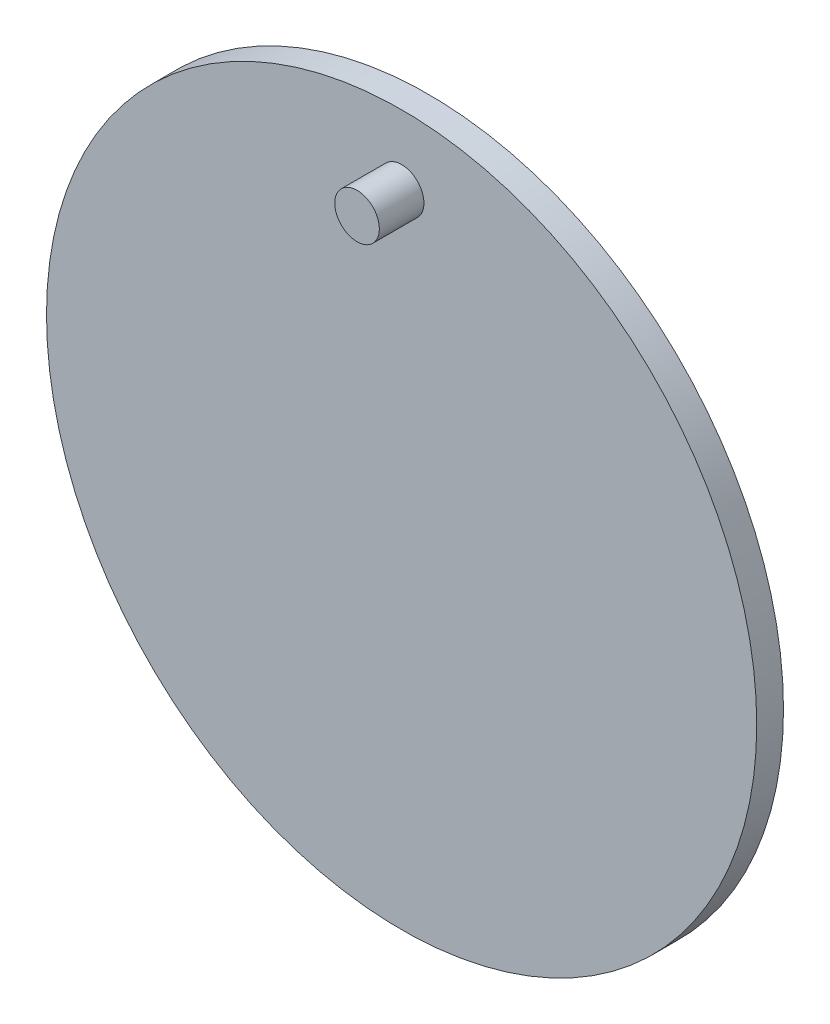
ISO-10303-21;
HEADER;
FILE_DESCRIPTION(('STEP AP214'),'2;1');
FILE_NAME('part.step','',(''),(''),'','','');
FILE_SCHEMA(('AUTOMOTIVE_DESIGN { 1 0 10303 214 1 1 1 1 }'));
ENDSEC;
DATA;
#1=APPLICATION_CONTEXT('core data for automotive mechanical design processes');
#2=APPLICATION_PROTOCOL_DEFINITION('international standard','automotive_design',2000,#1);
#3=PRODUCT_CONTEXT('',#1,'mechanical');
#4=PRODUCT('Part','Part','',(#3));
#5=PRODUCT_RELATED_PRODUCT_CATEGORY('part','',(#4));
#6=PRODUCT_DEFINITION_FORMATION('','',#4);
#7=PRODUCT_DEFINITION_CONTEXT('part definition',#1,'design');
#8=PRODUCT_DEFINITION('design','',#6,#7);
#9=PRODUCT_DEFINITION_SHAPE('','',#8);
#10=(LENGTH_UNIT() NAMED_UNIT(*) SI_UNIT(.MILLI.,.METRE.));
#11=(NAMED_UNIT(*) PLANE_ANGLE_UNIT() SI_UNIT($,.RADIAN.));
#12=(NAMED_UNIT(*) SI_UNIT($,.STERADIAN.) SOLID_ANGLE_UNIT());
#13=UNCERTAINTY_MEASURE_WITH_UNIT(LENGTH_MEASURE(1.E-05),#10,'distance_accuracy_value','');
#14=(GEOMETRIC_REPRESENTATION_CONTEXT(3) GLOBAL_UNCERTAINTY_ASSIGNED_CONTEXT((#13)) GLOBAL_UNIT_ASSIGNED_CONTEXT((#10,
#11,#12)) REPRESENTATION_CONTEXT('',''));
#15=CARTESIAN_POINT('',(0.,0.,0.));
#16=DIRECTION('',(0.,0.,1.));
#17=DIRECTION('',(1.,0.,0.));
#18=AXIS2_PLACEMENT_3D('',#15,#16,#17);
#19=CARTESIAN_POINT('',(0.,0.,3.));
#20=DIRECTION('',(0.,0.,-1.));
#21=DIRECTION('',(-1.,0.,0.));
#22=AXIS2_PLACEMENT_3D('',#19,#20,#21);
#23=CYLINDRICAL_SURFACE('',#22,39.83);
#24=CARTESIAN_POINT('',(0.,0.,3.));
#25=DIRECTION('',(0.,0.,1.));
#26=DIRECTION('',(1.,0.,0.));
#27=AXIS2_PLACEMENT_3D('',#24,#25,#26);
#28=CIRCLE('',#27,39.83);
#29=CARTESIAN_POINT('',(39.83,0.,3.));
#30=VERTEX_POINT('',#29);
#31=EDGE_CURVE('E10',#30,#30,#28,.T.);
#32=ORIENTED_EDGE('',*,*,#31,.F.);
#33=EDGE_LOOP('',(#32));
#34=FACE_BOUND('',#33,.T.);
#35=CARTESIAN_POINT('',(0.,0.,0.));
#36=DIRECTION('',(0.,0.,1.));
#37=DIRECTION('',(1.,0.,0.));
#38=AXIS2_PLACEMENT_3D('',#35,#36,#37);
#39=CIRCLE('',#38,39.83);
#40=CARTESIAN_POINT('',(39.83,0.,0.));
#41=VERTEX_POINT('',#40);
#42=EDGE_CURVE('E33',#41,#41,#39,.T.);
#43=ORIENTED_EDGE('',*,*,#42,.T.);
#44=EDGE_LOOP('',(#43));
#45=FACE_BOUND('',#44,.T.);
#46=ADVANCED_FACE('F30',(#34,#45),#23,.T.);
#47=CARTESIAN_POINT('',(0.,0.,3.));
#48=DIRECTION('',(0.,0.,1.));
#49=DIRECTION('',(1.,0.,0.));
#50=AXIS2_PLACEMENT_3D('',#47,#48,#49);
#51=PLANE('',#50);
#52=CARTESIAN_POINT('',(0.,32.,3.));
#53=DIRECTION('',(0.,0.,1.));
#54=DIRECTION('',(1.,0.,0.));
#55=AXIS2_PLACEMENT_3D('',#52,#53,#54);
#56=CIRCLE('',#55,2.5);
#57=CARTESIAN_POINT('',(2.5,32.,3.));
#58=VERTEX_POINT('',#57);
#59=EDGE_CURVE('E42',#58,#58,#56,.T.);
#60=ORIENTED_EDGE('',*,*,#59,.F.);
#61=EDGE_LOOP('',(#60));
#62=FACE_BOUND('',#61,.T.);
#63=ORIENTED_EDGE('',*,*,#31,.T.);
#64=EDGE_LOOP('',(#63));
#65=FACE_BOUND('',#64,.T.);
#66=ADVANCED_FACE('F57',(#62,#65),#51,.T.);
#67=CARTESIAN_POINT('',(0.,0.,0.));
#68=DIRECTION('',(0.,0.,1.));
#69=DIRECTION('',(1.,0.,0.));
#70=AXIS2_PLACEMENT_3D('',#67,#68,#69);
#71=PLANE('',#70);
#72=ORIENTED_EDGE('',*,*,#42,.F.);
#73=EDGE_LOOP('',(#72));
#74=FACE_BOUND('',#73,.T.);
#75=ADVANCED_FACE('F53',(#74),#71,.F.);
#76=CARTESIAN_POINT('',(0.,32.,8.));
#77=DIRECTION('',(0.,0.,-1.));
#78=DIRECTION('',(-1.,0.,0.));
#79=AXIS2_PLACEMENT_3D('',#76,#77,#78);
#80=CYLINDRICAL_SURFACE('',#79,2.5);
#81=CARTESIAN_POINT('',(0.,32.,8.));
#82=DIRECTION('',(0.,0.,1.));
#83=DIRECTION('',(1.,0.,0.));
#84=AXIS2_PLACEMENT_3D('',#81,#82,#83);
#85=CIRCLE('',#84,2.5);
#86=CARTESIAN_POINT('',(2.5,32.,8.));
#87=VERTEX_POINT('',#86);
#88=EDGE_CURVE('E40',#87,#87,#85,.T.);
#89=ORIENTED_EDGE('',*,*,#88,.F.);
#90=EDGE_LOOP('',(#89));
#91=FACE_BOUND('',#90,.T.);
#92=ORIENTED_EDGE('',*,*,#59,.T.);
#93=EDGE_LOOP('',(#92));
#94=FACE_BOUND('',#93,.T.);
#95=ADVANCED_FACE('F50',(#91,#94),#80,.T.);
#96=CARTESIAN_POINT('',(0.,32.,8.));
#97=DIRECTION('',(0.,0.,1.));
#98=DIRECTION('',(1.,0.,0.));
#99=AXIS2_PLACEMENT_3D('',#96,#97,#98);
#100=PLANE('',#99);
#101=ORIENTED_EDGE('',*,*,#88,.T.);
#102=EDGE_LOOP('',(#101));
#103=FACE_BOUND('',#102,.T.);
#104=ADVANCED_FACE('F48',(#103),#100,.T.);
#105=CLOSED_SHELL('',(#46,#66,#75,#95,#104));
#106=MANIFOLD_SOLID_BREP('B2',#105);
#107=ADVANCED_BREP_SHAPE_REPRESENTATION('',(#18,#106),#14);
#108=SHAPE_DEFINITION_REPRESENTATION(#9,#107);
ENDSEC;
END-ISO-10303-21;
